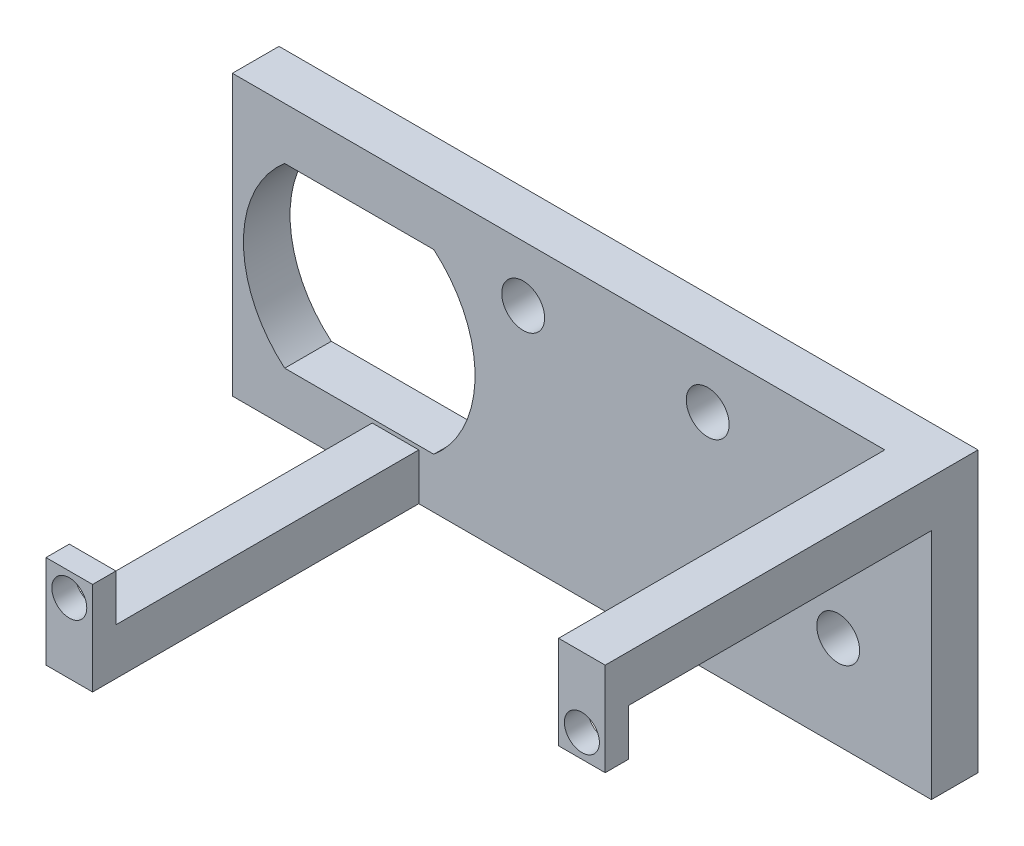
ISO-10303-21;
HEADER;
FILE_DESCRIPTION(('STEP AP214'),'2;1');
FILE_NAME('part.step','',(''),(''),'','','');
FILE_SCHEMA(('AUTOMOTIVE_DESIGN { 1 0 10303 214 1 1 1 1 }'));
ENDSEC;
DATA;
#1=APPLICATION_CONTEXT('core data for automotive mechanical design processes');
#2=APPLICATION_PROTOCOL_DEFINITION('international standard','automotive_design',2000,#1);
#3=PRODUCT_CONTEXT('',#1,'mechanical');
#4=PRODUCT('Part','Part','',(#3));
#5=PRODUCT_RELATED_PRODUCT_CATEGORY('part','',(#4));
#6=PRODUCT_DEFINITION_FORMATION('','',#4);
#7=PRODUCT_DEFINITION_CONTEXT('part definition',#1,'design');
#8=PRODUCT_DEFINITION('design','',#6,#7);
#9=PRODUCT_DEFINITION_SHAPE('','',#8);
#10=(LENGTH_UNIT() NAMED_UNIT(*) SI_UNIT(.MILLI.,.METRE.));
#11=(NAMED_UNIT(*) PLANE_ANGLE_UNIT() SI_UNIT($,.RADIAN.));
#12=(NAMED_UNIT(*) SI_UNIT($,.STERADIAN.) SOLID_ANGLE_UNIT());
#13=UNCERTAINTY_MEASURE_WITH_UNIT(LENGTH_MEASURE(1.E-05),#10,'distance_accuracy_value','');
#14=(GEOMETRIC_REPRESENTATION_CONTEXT(3) GLOBAL_UNCERTAINTY_ASSIGNED_CONTEXT((#13)) GLOBAL_UNIT_ASSIGNED_CONTEXT((#10,
#11,#12)) REPRESENTATION_CONTEXT('',''));
#15=CARTESIAN_POINT('',(0.,0.,0.));
#16=DIRECTION('',(0.,0.,1.));
#17=DIRECTION('',(1.,0.,0.));
#18=AXIS2_PLACEMENT_3D('',#15,#16,#17);
#19=CARTESIAN_POINT('',(-30.,-15.,5.));
#20=DIRECTION('',(1.,0.,0.));
#21=DIRECTION('',(0.,0.,-1.));
#22=AXIS2_PLACEMENT_3D('',#19,#20,#21);
#23=PLANE('',#22);
#24=DIRECTION('',(0.,1.,0.));
#25=VECTOR('',#24,1.);
#26=CARTESIAN_POINT('',(-30.,15.,5.));
#27=LINE('',#26,#25);
#28=CARTESIAN_POINT('',(-30.,-15.,5.));
#29=VERTEX_POINT('',#28);
#30=CARTESIAN_POINT('',(-30.,-10.,5.));
#31=VERTEX_POINT('',#30);
#32=EDGE_CURVE('E191',#29,#31,#27,.T.);
#33=ORIENTED_EDGE('',*,*,#32,.F.);
#34=DIRECTION('',(0.,0.,-1.));
#35=VECTOR('',#34,1.);
#36=CARTESIAN_POINT('',(-30.,-15.,5.));
#37=LINE('',#36,#35);
#38=CARTESIAN_POINT('',(-30.,-15.,40.));
#39=VERTEX_POINT('',#38);
#40=EDGE_CURVE('E47',#39,#29,#37,.T.);
#41=ORIENTED_EDGE('',*,*,#40,.F.);
#42=DIRECTION('',(0.,-1.,0.));
#43=VECTOR('',#42,1.);
#44=CARTESIAN_POINT('',(-30.,-15.,40.));
#45=LINE('',#44,#43);
#46=CARTESIAN_POINT('',(-30.,-5.,40.));
#47=VERTEX_POINT('',#46);
#48=EDGE_CURVE('E275',#47,#39,#45,.T.);
#49=ORIENTED_EDGE('',*,*,#48,.F.);
#50=DIRECTION('',(0.,0.,1.));
#51=VECTOR('',#50,1.);
#52=CARTESIAN_POINT('',(-30.,-5.,37.5));
#53=LINE('',#52,#51);
#54=CARTESIAN_POINT('',(-30.,-5.,37.5));
#55=VERTEX_POINT('',#54);
#56=EDGE_CURVE('E257',#55,#47,#53,.T.);
#57=ORIENTED_EDGE('',*,*,#56,.F.);
#58=DIRECTION('',(0.,-1.,0.));
#59=VECTOR('',#58,1.);
#60=CARTESIAN_POINT('',(-30.,-10.,37.5));
#61=LINE('',#60,#59);
#62=CARTESIAN_POINT('',(-30.,-10.,37.5));
#63=VERTEX_POINT('',#62);
#64=EDGE_CURVE('E242',#55,#63,#61,.T.);
#65=ORIENTED_EDGE('',*,*,#64,.T.);
#66=DIRECTION('',(0.,0.,-1.));
#67=VECTOR('',#66,1.);
#68=CARTESIAN_POINT('',(-30.,-10.,40.));
#69=LINE('',#68,#67);
#70=EDGE_CURVE('E267',#63,#31,#69,.T.);
#71=ORIENTED_EDGE('',*,*,#70,.T.);
#72=EDGE_LOOP('',(#33,#41,#49,#57,#65,#71));
#73=FACE_BOUND('',#72,.T.);
#74=ADVANCED_FACE('F39',(#73),#23,.F.);
#75=CARTESIAN_POINT('',(30.,10.,40.));
#76=DIRECTION('',(0.,1.,0.));
#77=DIRECTION('',(0.,0.,1.));
#78=AXIS2_PLACEMENT_3D('',#75,#76,#77);
#79=PLANE('',#78);
#80=DIRECTION('',(-1.,0.,0.));
#81=VECTOR('',#80,1.);
#82=CARTESIAN_POINT('',(25.,10.,37.5));
#83=LINE('',#82,#81);
#84=CARTESIAN_POINT('',(30.,10.,37.5));
#85=VERTEX_POINT('',#84);
#86=CARTESIAN_POINT('',(25.,10.,37.5));
#87=VERTEX_POINT('',#86);
#88=EDGE_CURVE('E213',#85,#87,#83,.T.);
#89=ORIENTED_EDGE('',*,*,#88,.T.);
#90=DIRECTION('',(0.,0.,-1.));
#91=VECTOR('',#90,1.);
#92=CARTESIAN_POINT('',(25.,10.,40.));
#93=LINE('',#92,#91);
#94=CARTESIAN_POINT('',(25.,10.,5.));
#95=VERTEX_POINT('',#94);
#96=EDGE_CURVE('E298',#87,#95,#93,.T.);
#97=ORIENTED_EDGE('',*,*,#96,.T.);
#98=DIRECTION('',(1.,0.,0.));
#99=VECTOR('',#98,1.);
#100=CARTESIAN_POINT('',(30.,10.,5.));
#101=LINE('',#100,#99);
#102=CARTESIAN_POINT('',(30.,10.,5.));
#103=VERTEX_POINT('',#102);
#104=EDGE_CURVE('E288',#95,#103,#101,.T.);
#105=ORIENTED_EDGE('',*,*,#104,.T.);
#106=DIRECTION('',(0.,0.,-1.));
#107=VECTOR('',#106,1.);
#108=CARTESIAN_POINT('',(30.,10.,40.));
#109=LINE('',#108,#107);
#110=EDGE_CURVE('E292',#85,#103,#109,.T.);
#111=ORIENTED_EDGE('',*,*,#110,.F.);
#112=EDGE_LOOP('',(#89,#97,#105,#111));
#113=FACE_BOUND('',#112,.T.);
#114=ADVANCED_FACE('F370',(#113),#79,.F.);
#115=CARTESIAN_POINT('',(0.,0.,5.));
#116=DIRECTION('',(0.,0.,-1.));
#117=DIRECTION('',(-1.,0.,0.));
#118=AXIS2_PLACEMENT_3D('',#115,#116,#117);
#119=PLANE('',#118);
#120=DIRECTION('',(-1.,0.,0.));
#121=VECTOR('',#120,1.);
#122=CARTESIAN_POINT('',(-23.3941712058157,9.42,5.));
#123=LINE('',#122,#121);
#124=CARTESIAN_POINT('',(-23.3941712058157,9.42,5.));
#125=VERTEX_POINT('',#124);
#126=CARTESIAN_POINT('',(-39.3867351028274,9.42,5.));
#127=VERTEX_POINT('',#126);
#128=EDGE_CURVE('E174',#125,#127,#123,.T.);
#129=ORIENTED_EDGE('',*,*,#128,.F.);
#130=CARTESIAN_POINT('',(-31.3904531543216,-0.0899999999999981,5.));
#131=DIRECTION('',(0.,0.,-1.));
#132=DIRECTION('',(-1.,0.,0.));
#133=AXIS2_PLACEMENT_3D('',#130,#131,#132);
#134=CIRCLE('',#133,12.425);
#135=CARTESIAN_POINT('',(-23.3941712058157,-9.6,5.));
#136=VERTEX_POINT('',#135);
#137=EDGE_CURVE('E181',#136,#125,#134,.F.);
#138=ORIENTED_EDGE('',*,*,#137,.F.);
#139=DIRECTION('',(1.,0.,0.));
#140=VECTOR('',#139,1.);
#141=CARTESIAN_POINT('',(-23.3941712058157,-9.6,5.));
#142=LINE('',#141,#140);
#143=CARTESIAN_POINT('',(-39.3867351028274,-9.6,5.));
#144=VERTEX_POINT('',#143);
#145=EDGE_CURVE('E186',#144,#136,#142,.T.);
#146=ORIENTED_EDGE('',*,*,#145,.F.);
#147=CARTESIAN_POINT('',(-31.3904531543216,-0.0899999999999981,5.));
#148=DIRECTION('',(0.,0.,-1.));
#149=DIRECTION('',(-1.,0.,0.));
#150=AXIS2_PLACEMENT_3D('',#147,#148,#149);
#151=CIRCLE('',#150,12.425);
#152=EDGE_CURVE('E54',#127,#144,#151,.F.);
#153=ORIENTED_EDGE('',*,*,#152,.F.);
#154=EDGE_LOOP('',(#129,#138,#146,#153));
#155=FACE_BOUND('',#154,.T.);
#156=CARTESIAN_POINT('',(-13.8007142674936,9.00071426749366,5.));
#157=DIRECTION('',(0.,0.,1.));
#158=DIRECTION('',(1.,0.,0.));
#159=AXIS2_PLACEMENT_3D('',#156,#157,#158);
#160=CIRCLE('',#159,2.3);
#161=CARTESIAN_POINT('',(-11.5007142674936,9.00071426749366,5.));
#162=VERTEX_POINT('',#161);
#163=EDGE_CURVE('E316',#162,#162,#160,.T.);
#164=ORIENTED_EDGE('',*,*,#163,.F.);
#165=EDGE_LOOP('',(#164));
#166=FACE_BOUND('',#165,.T.);
#167=CARTESIAN_POINT('',(5.99928573250638,9.00071426749366,5.));
#168=DIRECTION('',(0.,0.,1.));
#169=DIRECTION('',(1.,0.,0.));
#170=AXIS2_PLACEMENT_3D('',#167,#168,#169);
#171=CIRCLE('',#170,2.3);
#172=CARTESIAN_POINT('',(8.29928573250638,9.00071426749366,5.));
#173=VERTEX_POINT('',#172);
#174=EDGE_CURVE('E310',#173,#173,#171,.T.);
#175=ORIENTED_EDGE('',*,*,#174,.F.);
#176=EDGE_LOOP('',(#175));
#177=FACE_BOUND('',#176,.T.);
#178=CARTESIAN_POINT('',(20.,-5.,5.));
#179=DIRECTION('',(0.,0.,1.));
#180=DIRECTION('',(1.,0.,0.));
#181=AXIS2_PLACEMENT_3D('',#178,#179,#180);
#182=CIRCLE('',#181,2.3);
#183=CARTESIAN_POINT('',(22.3,-5.,5.));
#184=VERTEX_POINT('',#183);
#185=EDGE_CURVE('E304',#184,#184,#182,.T.);
#186=ORIENTED_EDGE('',*,*,#185,.F.);
#187=EDGE_LOOP('',(#186));
#188=FACE_BOUND('',#187,.T.);
#189=DIRECTION('',(0.,1.,0.));
#190=VECTOR('',#189,1.);
#191=CARTESIAN_POINT('',(-25.,-15.,5.));
#192=LINE('',#191,#190);
#193=CARTESIAN_POINT('',(-25.,-15.,5.));
#194=VERTEX_POINT('',#193);
#195=CARTESIAN_POINT('',(-25.,-10.,5.));
#196=VERTEX_POINT('',#195);
#197=EDGE_CURVE('E274',#194,#196,#192,.T.);
#198=ORIENTED_EDGE('',*,*,#197,.F.);
#199=DIRECTION('',(1.,0.,0.));
#200=VECTOR('',#199,1.);
#201=CARTESIAN_POINT('',(-30.,-15.,5.));
#202=LINE('',#201,#200);
#203=CARTESIAN_POINT('',(30.,-15.,5.));
#204=VERTEX_POINT('',#203);
#205=EDGE_CURVE('E328',#194,#204,#202,.T.);
#206=ORIENTED_EDGE('',*,*,#205,.T.);
#207=DIRECTION('',(0.,1.,0.));
#208=VECTOR('',#207,1.);
#209=CARTESIAN_POINT('',(30.,-15.,5.));
#210=LINE('',#209,#208);
#211=EDGE_CURVE('E322',#204,#103,#210,.T.);
#212=ORIENTED_EDGE('',*,*,#211,.T.);
#213=ORIENTED_EDGE('',*,*,#104,.F.);
#214=DIRECTION('',(0.,-1.,0.));
#215=VECTOR('',#214,1.);
#216=CARTESIAN_POINT('',(25.,15.,5.));
#217=LINE('',#216,#215);
#218=CARTESIAN_POINT('',(25.,15.,5.));
#219=VERTEX_POINT('',#218);
#220=EDGE_CURVE('E278',#219,#95,#217,.T.);
#221=ORIENTED_EDGE('',*,*,#220,.F.);
#222=DIRECTION('',(-1.,0.,0.));
#223=VECTOR('',#222,1.);
#224=CARTESIAN_POINT('',(-30.,15.,5.));
#225=LINE('',#224,#223);
#226=CARTESIAN_POINT('',(-45.,15.,5.));
#227=VERTEX_POINT('',#226);
#228=EDGE_CURVE('E325',#219,#227,#225,.T.);
#229=ORIENTED_EDGE('',*,*,#228,.T.);
#230=DIRECTION('',(0.,1.,0.));
#231=VECTOR('',#230,1.);
#232=CARTESIAN_POINT('',(-45.,15.,5.));
#233=LINE('',#232,#231);
#234=CARTESIAN_POINT('',(-45.,-15.,5.));
#235=VERTEX_POINT('',#234);
#236=EDGE_CURVE('E200',#235,#227,#233,.T.);
#237=ORIENTED_EDGE('',*,*,#236,.F.);
#238=DIRECTION('',(1.,0.,0.));
#239=VECTOR('',#238,1.);
#240=CARTESIAN_POINT('',(-45.,-15.,5.));
#241=LINE('',#240,#239);
#242=EDGE_CURVE('E206',#235,#29,#241,.T.);
#243=ORIENTED_EDGE('',*,*,#242,.T.);
#244=ORIENTED_EDGE('',*,*,#32,.T.);
#245=DIRECTION('',(-1.,0.,0.));
#246=VECTOR('',#245,1.);
#247=CARTESIAN_POINT('',(-30.,-10.,5.));
#248=LINE('',#247,#246);
#249=EDGE_CURVE('E271',#196,#31,#248,.T.);
#250=ORIENTED_EDGE('',*,*,#249,.F.);
#251=EDGE_LOOP('',(#198,#206,#212,#213,#221,#229,#237,#243,#244,#250));
#252=FACE_BOUND('',#251,.T.);
#253=ADVANCED_FACE('F188',(#155,#166,#177,#188,#252),#119,.F.);
#254=CARTESIAN_POINT('',(0.,0.,0.));
#255=DIRECTION('',(0.,0.,-1.));
#256=DIRECTION('',(-1.,0.,0.));
#257=AXIS2_PLACEMENT_3D('',#254,#255,#256);
#258=PLANE('',#257);
#259=CARTESIAN_POINT('',(-31.3904531543216,-0.0899999999999981,0.));
#260=DIRECTION('',(0.,0.,-1.));
#261=DIRECTION('',(-1.,0.,0.));
#262=AXIS2_PLACEMENT_3D('',#259,#260,#261);
#263=CIRCLE('',#262,12.425);
#264=CARTESIAN_POINT('',(-23.3941712058157,9.42,0.));
#265=VERTEX_POINT('',#264);
#266=CARTESIAN_POINT('',(-23.3941712058157,-9.6,0.));
#267=VERTEX_POINT('',#266);
#268=EDGE_CURVE('E62',#265,#267,#263,.T.);
#269=ORIENTED_EDGE('',*,*,#268,.F.);
#270=DIRECTION('',(1.,0.,0.));
#271=VECTOR('',#270,1.);
#272=CARTESIAN_POINT('',(-23.3941712058157,9.42,0.));
#273=LINE('',#272,#271);
#274=CARTESIAN_POINT('',(-39.3867351028274,9.42,0.));
#275=VERTEX_POINT('',#274);
#276=EDGE_CURVE('E176',#275,#265,#273,.T.);
#277=ORIENTED_EDGE('',*,*,#276,.F.);
#278=CARTESIAN_POINT('',(-31.3904531543216,-0.0899999999999981,0.));
#279=DIRECTION('',(0.,0.,-1.));
#280=DIRECTION('',(-1.,0.,0.));
#281=AXIS2_PLACEMENT_3D('',#278,#279,#280);
#282=CIRCLE('',#281,12.425);
#283=CARTESIAN_POINT('',(-39.3867351028274,-9.6,0.));
#284=VERTEX_POINT('',#283);
#285=EDGE_CURVE('E581',#284,#275,#282,.T.);
#286=ORIENTED_EDGE('',*,*,#285,.F.);
#287=DIRECTION('',(-1.,0.,0.));
#288=VECTOR('',#287,1.);
#289=CARTESIAN_POINT('',(-23.3941712058157,-9.6,0.));
#290=LINE('',#289,#288);
#291=EDGE_CURVE('E589',#267,#284,#290,.T.);
#292=ORIENTED_EDGE('',*,*,#291,.F.);
#293=EDGE_LOOP('',(#269,#277,#286,#292));
#294=FACE_BOUND('',#293,.T.);
#295=CARTESIAN_POINT('',(5.99928573250638,9.00071426749366,0.));
#296=DIRECTION('',(0.,0.,1.));
#297=DIRECTION('',(1.,0.,0.));
#298=AXIS2_PLACEMENT_3D('',#295,#296,#297);
#299=CIRCLE('',#298,2.3);
#300=CARTESIAN_POINT('',(8.29928573250638,9.00071426749366,0.));
#301=VERTEX_POINT('',#300);
#302=EDGE_CURVE('E307',#301,#301,#299,.T.);
#303=ORIENTED_EDGE('',*,*,#302,.T.);
#304=EDGE_LOOP('',(#303));
#305=FACE_BOUND('',#304,.T.);
#306=DIRECTION('',(0.,1.,0.));
#307=VECTOR('',#306,1.);
#308=CARTESIAN_POINT('',(30.,-15.,0.));
#309=LINE('',#308,#307);
#310=CARTESIAN_POINT('',(30.,-15.,0.));
#311=VERTEX_POINT('',#310);
#312=CARTESIAN_POINT('',(30.,15.,0.));
#313=VERTEX_POINT('',#312);
#314=EDGE_CURVE('E319',#311,#313,#309,.T.);
#315=ORIENTED_EDGE('',*,*,#314,.F.);
#316=DIRECTION('',(1.,0.,0.));
#317=VECTOR('',#316,1.);
#318=CARTESIAN_POINT('',(-30.,-15.,0.));
#319=LINE('',#318,#317);
#320=CARTESIAN_POINT('',(-45.,-15.,0.));
#321=VERTEX_POINT('',#320);
#322=EDGE_CURVE('E326',#321,#311,#319,.T.);
#323=ORIENTED_EDGE('',*,*,#322,.F.);
#324=DIRECTION('',(0.,-1.,0.));
#325=VECTOR('',#324,1.);
#326=CARTESIAN_POINT('',(-45.,-15.,0.));
#327=LINE('',#326,#325);
#328=CARTESIAN_POINT('',(-45.,15.,0.));
#329=VERTEX_POINT('',#328);
#330=EDGE_CURVE('E195',#329,#321,#327,.T.);
#331=ORIENTED_EDGE('',*,*,#330,.F.);
#332=DIRECTION('',(-1.,0.,0.));
#333=VECTOR('',#332,1.);
#334=CARTESIAN_POINT('',(-30.,15.,0.));
#335=LINE('',#334,#333);
#336=EDGE_CURVE('E333',#313,#329,#335,.T.);
#337=ORIENTED_EDGE('',*,*,#336,.F.);
#338=EDGE_LOOP('',(#315,#323,#331,#337));
#339=FACE_BOUND('',#338,.T.);
#340=CARTESIAN_POINT('',(-13.8007142674936,9.00071426749366,0.));
#341=DIRECTION('',(0.,0.,1.));
#342=DIRECTION('',(1.,0.,0.));
#343=AXIS2_PLACEMENT_3D('',#340,#341,#342);
#344=CIRCLE('',#343,2.3);
#345=CARTESIAN_POINT('',(-11.5007142674936,9.00071426749366,0.));
#346=VERTEX_POINT('',#345);
#347=EDGE_CURVE('E313',#346,#346,#344,.T.);
#348=ORIENTED_EDGE('',*,*,#347,.T.);
#349=EDGE_LOOP('',(#348));
#350=FACE_BOUND('',#349,.T.);
#351=CARTESIAN_POINT('',(20.,-5.,0.));
#352=DIRECTION('',(0.,0.,1.));
#353=DIRECTION('',(1.,0.,0.));
#354=AXIS2_PLACEMENT_3D('',#351,#352,#353);
#355=CIRCLE('',#354,2.3);
#356=CARTESIAN_POINT('',(22.3,-5.,0.));
#357=VERTEX_POINT('',#356);
#358=EDGE_CURVE('E303',#357,#357,#355,.T.);
#359=ORIENTED_EDGE('',*,*,#358,.T.);
#360=EDGE_LOOP('',(#359));
#361=FACE_BOUND('',#360,.T.);
#362=ADVANCED_FACE('F362',(#294,#305,#339,#350,#361),#258,.T.);
#363=CARTESIAN_POINT('',(30.,-15.,5.));
#364=DIRECTION('',(-1.,0.,0.));
#365=DIRECTION('',(0.,0.,1.));
#366=AXIS2_PLACEMENT_3D('',#363,#364,#365);
#367=PLANE('',#366);
#368=ORIENTED_EDGE('',*,*,#314,.T.);
#369=DIRECTION('',(0.,0.,-1.));
#370=VECTOR('',#369,1.);
#371=CARTESIAN_POINT('',(30.,15.,5.));
#372=LINE('',#371,#370);
#373=CARTESIAN_POINT('',(30.,15.,40.));
#374=VERTEX_POINT('',#373);
#375=EDGE_CURVE('E11',#374,#313,#372,.T.);
#376=ORIENTED_EDGE('',*,*,#375,.F.);
#377=DIRECTION('',(0.,1.,0.));
#378=VECTOR('',#377,1.);
#379=CARTESIAN_POINT('',(30.,15.,40.));
#380=LINE('',#379,#378);
#381=CARTESIAN_POINT('',(30.,5.,40.));
#382=VERTEX_POINT('',#381);
#383=EDGE_CURVE('E284',#382,#374,#380,.T.);
#384=ORIENTED_EDGE('',*,*,#383,.F.);
#385=DIRECTION('',(0.,0.,1.));
#386=VECTOR('',#385,1.);
#387=CARTESIAN_POINT('',(30.,5.,37.5));
#388=LINE('',#387,#386);
#389=CARTESIAN_POINT('',(30.,5.,37.5));
#390=VERTEX_POINT('',#389);
#391=EDGE_CURVE('E209',#390,#382,#388,.T.);
#392=ORIENTED_EDGE('',*,*,#391,.F.);
#393=DIRECTION('',(0.,1.,0.));
#394=VECTOR('',#393,1.);
#395=CARTESIAN_POINT('',(30.,10.,37.5));
#396=LINE('',#395,#394);
#397=EDGE_CURVE('E223',#390,#85,#396,.T.);
#398=ORIENTED_EDGE('',*,*,#397,.T.);
#399=ORIENTED_EDGE('',*,*,#110,.T.);
#400=ORIENTED_EDGE('',*,*,#211,.F.);
#401=DIRECTION('',(0.,0.,-1.));
#402=VECTOR('',#401,1.);
#403=CARTESIAN_POINT('',(30.,-15.,5.));
#404=LINE('',#403,#402);
#405=EDGE_CURVE('E330',#204,#311,#404,.T.);
#406=ORIENTED_EDGE('',*,*,#405,.T.);
#407=EDGE_LOOP('',(#368,#376,#384,#392,#398,#399,#400,#406));
#408=FACE_BOUND('',#407,.T.);
#409=ADVANCED_FACE('F41',(#408),#367,.F.);
#410=CARTESIAN_POINT('',(-30.,15.,5.));
#411=DIRECTION('',(0.,-1.,0.));
#412=DIRECTION('',(0.,0.,-1.));
#413=AXIS2_PLACEMENT_3D('',#410,#411,#412);
#414=PLANE('',#413);
#415=ORIENTED_EDGE('',*,*,#336,.T.);
#416=DIRECTION('',(0.,0.,-1.));
#417=VECTOR('',#416,1.);
#418=CARTESIAN_POINT('',(-45.,15.,0.));
#419=LINE('',#418,#417);
#420=EDGE_CURVE('E203',#227,#329,#419,.T.);
#421=ORIENTED_EDGE('',*,*,#420,.F.);
#422=ORIENTED_EDGE('',*,*,#228,.F.);
#423=DIRECTION('',(0.,0.,-1.));
#424=VECTOR('',#423,1.);
#425=CARTESIAN_POINT('',(25.,15.,40.));
#426=LINE('',#425,#424);
#427=CARTESIAN_POINT('',(25.,15.,40.));
#428=VERTEX_POINT('',#427);
#429=EDGE_CURVE('E300',#428,#219,#426,.T.);
#430=ORIENTED_EDGE('',*,*,#429,.F.);
#431=DIRECTION('',(-1.,0.,0.));
#432=VECTOR('',#431,1.);
#433=CARTESIAN_POINT('',(30.,15.,40.));
#434=LINE('',#433,#432);
#435=EDGE_CURVE('E287',#374,#428,#434,.T.);
#436=ORIENTED_EDGE('',*,*,#435,.F.);
#437=ORIENTED_EDGE('',*,*,#375,.T.);
#438=EDGE_LOOP('',(#415,#421,#422,#430,#436,#437));
#439=FACE_BOUND('',#438,.T.);
#440=ADVANCED_FACE('F357',(#439),#414,.F.);
#441=CARTESIAN_POINT('',(-30.,-15.,5.));
#442=DIRECTION('',(0.,1.,0.));
#443=DIRECTION('',(0.,0.,1.));
#444=AXIS2_PLACEMENT_3D('',#441,#442,#443);
#445=PLANE('',#444);
#446=ORIENTED_EDGE('',*,*,#322,.T.);
#447=ORIENTED_EDGE('',*,*,#405,.F.);
#448=ORIENTED_EDGE('',*,*,#205,.F.);
#449=DIRECTION('',(0.,0.,-1.));
#450=VECTOR('',#449,1.);
#451=CARTESIAN_POINT('',(-25.,-15.,40.));
#452=LINE('',#451,#450);
#453=CARTESIAN_POINT('',(-25.,-15.,40.));
#454=VERTEX_POINT('',#453);
#455=EDGE_CURVE('E260',#454,#194,#452,.T.);
#456=ORIENTED_EDGE('',*,*,#455,.F.);
#457=DIRECTION('',(1.,0.,0.));
#458=VECTOR('',#457,1.);
#459=CARTESIAN_POINT('',(-30.,-15.,40.));
#460=LINE('',#459,#458);
#461=EDGE_CURVE('E280',#39,#454,#460,.T.);
#462=ORIENTED_EDGE('',*,*,#461,.F.);
#463=ORIENTED_EDGE('',*,*,#40,.T.);
#464=ORIENTED_EDGE('',*,*,#242,.F.);
#465=DIRECTION('',(0.,0.,1.));
#466=VECTOR('',#465,1.);
#467=CARTESIAN_POINT('',(-45.,-15.,5.));
#468=LINE('',#467,#466);
#469=EDGE_CURVE('E198',#321,#235,#468,.T.);
#470=ORIENTED_EDGE('',*,*,#469,.F.);
#471=EDGE_LOOP('',(#446,#447,#448,#456,#462,#463,#464,#470));
#472=FACE_BOUND('',#471,.T.);
#473=ADVANCED_FACE('F341',(#472),#445,.F.);
#474=CARTESIAN_POINT('',(-13.8007142674936,9.00071426749366,5.));
#475=DIRECTION('',(0.,0.,-1.));
#476=DIRECTION('',(-1.,0.,0.));
#477=AXIS2_PLACEMENT_3D('',#474,#475,#476);
#478=CYLINDRICAL_SURFACE('',#477,2.3);
#479=ORIENTED_EDGE('',*,*,#163,.T.);
#480=EDGE_LOOP('',(#479));
#481=FACE_BOUND('',#480,.T.);
#482=ORIENTED_EDGE('',*,*,#347,.F.);
#483=EDGE_LOOP('',(#482));
#484=FACE_BOUND('',#483,.T.);
#485=ADVANCED_FACE('F410',(#481,#484),#478,.F.);
#486=CARTESIAN_POINT('',(5.99928573250638,9.00071426749366,5.));
#487=DIRECTION('',(0.,0.,-1.));
#488=DIRECTION('',(-1.,0.,0.));
#489=AXIS2_PLACEMENT_3D('',#486,#487,#488);
#490=CYLINDRICAL_SURFACE('',#489,2.3);
#491=ORIENTED_EDGE('',*,*,#174,.T.);
#492=EDGE_LOOP('',(#491));
#493=FACE_BOUND('',#492,.T.);
#494=ORIENTED_EDGE('',*,*,#302,.F.);
#495=EDGE_LOOP('',(#494));
#496=FACE_BOUND('',#495,.T.);
#497=ADVANCED_FACE('F426',(#493,#496),#490,.F.);
#498=CARTESIAN_POINT('',(20.,-5.,5.));
#499=DIRECTION('',(0.,0.,-1.));
#500=DIRECTION('',(-1.,0.,0.));
#501=AXIS2_PLACEMENT_3D('',#498,#499,#500);
#502=CYLINDRICAL_SURFACE('',#501,2.3);
#503=ORIENTED_EDGE('',*,*,#185,.T.);
#504=EDGE_LOOP('',(#503));
#505=FACE_BOUND('',#504,.T.);
#506=ORIENTED_EDGE('',*,*,#358,.F.);
#507=EDGE_LOOP('',(#506));
#508=FACE_BOUND('',#507,.T.);
#509=ADVANCED_FACE('F430',(#505,#508),#502,.F.);
#510=CARTESIAN_POINT('',(25.,15.,40.));
#511=DIRECTION('',(1.,0.,0.));
#512=DIRECTION('',(0.,0.,-1.));
#513=AXIS2_PLACEMENT_3D('',#510,#511,#512);
#514=PLANE('',#513);
#515=ORIENTED_EDGE('',*,*,#220,.T.);
#516=ORIENTED_EDGE('',*,*,#96,.F.);
#517=DIRECTION('',(0.,-1.,0.));
#518=VECTOR('',#517,1.);
#519=CARTESIAN_POINT('',(25.,10.,37.5));
#520=LINE('',#519,#518);
#521=CARTESIAN_POINT('',(25.,5.,37.5));
#522=VERTEX_POINT('',#521);
#523=EDGE_CURVE('E220',#87,#522,#520,.T.);
#524=ORIENTED_EDGE('',*,*,#523,.T.);
#525=DIRECTION('',(0.,0.,1.));
#526=VECTOR('',#525,1.);
#527=CARTESIAN_POINT('',(25.,5.,37.5));
#528=LINE('',#527,#526);
#529=CARTESIAN_POINT('',(25.,5.,40.));
#530=VERTEX_POINT('',#529);
#531=EDGE_CURVE('E210',#522,#530,#528,.T.);
#532=ORIENTED_EDGE('',*,*,#531,.T.);
#533=DIRECTION('',(0.,-1.,0.));
#534=VECTOR('',#533,1.);
#535=CARTESIAN_POINT('',(25.,15.,40.));
#536=LINE('',#535,#534);
#537=EDGE_CURVE('E290',#428,#530,#536,.T.);
#538=ORIENTED_EDGE('',*,*,#537,.F.);
#539=ORIENTED_EDGE('',*,*,#429,.T.);
#540=EDGE_LOOP('',(#515,#516,#524,#532,#538,#539));
#541=FACE_BOUND('',#540,.T.);
#542=ADVANCED_FACE('F374',(#541),#514,.F.);
#543=CARTESIAN_POINT('',(0.,0.,40.));
#544=DIRECTION('',(0.,0.,-1.));
#545=DIRECTION('',(-1.,0.,0.));
#546=AXIS2_PLACEMENT_3D('',#543,#544,#545);
#547=PLANE('',#546);
#548=ORIENTED_EDGE('',*,*,#383,.T.);
#549=ORIENTED_EDGE('',*,*,#435,.T.);
#550=ORIENTED_EDGE('',*,*,#537,.T.);
#551=DIRECTION('',(1.,0.,0.));
#552=VECTOR('',#551,1.);
#553=CARTESIAN_POINT('',(25.,5.,40.));
#554=LINE('',#553,#552);
#555=EDGE_CURVE('E216',#530,#382,#554,.T.);
#556=ORIENTED_EDGE('',*,*,#555,.T.);
#557=EDGE_LOOP('',(#548,#549,#550,#556));
#558=FACE_BOUND('',#557,.T.);
#559=CARTESIAN_POINT('',(27.5,7.5,40.));
#560=DIRECTION('',(0.,0.,1.));
#561=DIRECTION('',(1.,0.,0.));
#562=AXIS2_PLACEMENT_3D('',#559,#560,#561);
#563=CIRCLE('',#562,1.875);
#564=CARTESIAN_POINT('',(29.375,7.5,40.));
#565=VERTEX_POINT('',#564);
#566=EDGE_CURVE('E230',#565,#565,#563,.T.);
#567=ORIENTED_EDGE('',*,*,#566,.F.);
#568=EDGE_LOOP('',(#567));
#569=FACE_BOUND('',#568,.T.);
#570=ADVANCED_FACE('F377',(#558,#569),#547,.F.);
#571=CARTESIAN_POINT('',(-25.,-15.,40.));
#572=DIRECTION('',(-1.,0.,0.));
#573=DIRECTION('',(0.,0.,1.));
#574=AXIS2_PLACEMENT_3D('',#571,#572,#573);
#575=PLANE('',#574);
#576=ORIENTED_EDGE('',*,*,#197,.T.);
#577=DIRECTION('',(0.,0.,-1.));
#578=VECTOR('',#577,1.);
#579=CARTESIAN_POINT('',(-25.,-10.,40.));
#580=LINE('',#579,#578);
#581=CARTESIAN_POINT('',(-25.,-10.,37.5));
#582=VERTEX_POINT('',#581);
#583=EDGE_CURVE('E265',#582,#196,#580,.T.);
#584=ORIENTED_EDGE('',*,*,#583,.F.);
#585=DIRECTION('',(0.,1.,0.));
#586=VECTOR('',#585,1.);
#587=CARTESIAN_POINT('',(-25.,-10.,37.5));
#588=LINE('',#587,#586);
#589=CARTESIAN_POINT('',(-25.,-5.,37.5));
#590=VERTEX_POINT('',#589);
#591=EDGE_CURVE('E248',#582,#590,#588,.T.);
#592=ORIENTED_EDGE('',*,*,#591,.T.);
#593=DIRECTION('',(0.,0.,1.));
#594=VECTOR('',#593,1.);
#595=CARTESIAN_POINT('',(-25.,-5.,37.5));
#596=LINE('',#595,#594);
#597=CARTESIAN_POINT('',(-25.,-5.,40.));
#598=VERTEX_POINT('',#597);
#599=EDGE_CURVE('E254',#590,#598,#596,.T.);
#600=ORIENTED_EDGE('',*,*,#599,.T.);
#601=DIRECTION('',(0.,1.,0.));
#602=VECTOR('',#601,1.);
#603=CARTESIAN_POINT('',(-25.,-15.,40.));
#604=LINE('',#603,#602);
#605=EDGE_CURVE('E270',#454,#598,#604,.T.);
#606=ORIENTED_EDGE('',*,*,#605,.F.);
#607=ORIENTED_EDGE('',*,*,#455,.T.);
#608=EDGE_LOOP('',(#576,#584,#592,#600,#606,#607));
#609=FACE_BOUND('',#608,.T.);
#610=ADVANCED_FACE('F438',(#609),#575,.F.);
#611=CARTESIAN_POINT('',(-30.,-10.,40.));
#612=DIRECTION('',(0.,-1.,0.));
#613=DIRECTION('',(1.,0.,0.));
#614=AXIS2_PLACEMENT_3D('',#611,#612,#613);
#615=PLANE('',#614);
#616=ORIENTED_EDGE('',*,*,#70,.F.);
#617=DIRECTION('',(1.,0.,0.));
#618=VECTOR('',#617,1.);
#619=CARTESIAN_POINT('',(-30.,-10.,37.5));
#620=LINE('',#619,#618);
#621=EDGE_CURVE('E245',#63,#582,#620,.T.);
#622=ORIENTED_EDGE('',*,*,#621,.T.);
#623=ORIENTED_EDGE('',*,*,#583,.T.);
#624=ORIENTED_EDGE('',*,*,#249,.T.);
#625=EDGE_LOOP('',(#616,#622,#623,#624));
#626=FACE_BOUND('',#625,.T.);
#627=ADVANCED_FACE('F443',(#626),#615,.F.);
#628=CARTESIAN_POINT('',(0.,0.,40.));
#629=DIRECTION('',(0.,0.,-1.));
#630=DIRECTION('',(-1.,0.,0.));
#631=AXIS2_PLACEMENT_3D('',#628,#629,#630);
#632=PLANE('',#631);
#633=ORIENTED_EDGE('',*,*,#48,.T.);
#634=ORIENTED_EDGE('',*,*,#461,.T.);
#635=ORIENTED_EDGE('',*,*,#605,.T.);
#636=DIRECTION('',(-1.,0.,0.));
#637=VECTOR('',#636,1.);
#638=CARTESIAN_POINT('',(-30.,-5.,40.));
#639=LINE('',#638,#637);
#640=EDGE_CURVE('E239',#598,#47,#639,.T.);
#641=ORIENTED_EDGE('',*,*,#640,.T.);
#642=EDGE_LOOP('',(#633,#634,#635,#641));
#643=FACE_BOUND('',#642,.T.);
#644=CARTESIAN_POINT('',(-27.5,-7.5,40.));
#645=DIRECTION('',(0.,0.,1.));
#646=DIRECTION('',(1.,0.,0.));
#647=AXIS2_PLACEMENT_3D('',#644,#645,#646);
#648=CIRCLE('',#647,1.875);
#649=CARTESIAN_POINT('',(-25.625,-7.5,40.));
#650=VERTEX_POINT('',#649);
#651=EDGE_CURVE('E233',#650,#650,#648,.T.);
#652=ORIENTED_EDGE('',*,*,#651,.F.);
#653=EDGE_LOOP('',(#652));
#654=FACE_BOUND('',#653,.T.);
#655=ADVANCED_FACE('F439',(#643,#654),#632,.F.);
#656=CARTESIAN_POINT('',(-30.,-5.,37.5));
#657=DIRECTION('',(0.,1.,0.));
#658=DIRECTION('',(0.,0.,1.));
#659=AXIS2_PLACEMENT_3D('',#656,#657,#658);
#660=PLANE('',#659);
#661=ORIENTED_EDGE('',*,*,#640,.F.);
#662=ORIENTED_EDGE('',*,*,#599,.F.);
#663=DIRECTION('',(-1.,0.,0.));
#664=VECTOR('',#663,1.);
#665=CARTESIAN_POINT('',(-30.,-5.,37.5));
#666=LINE('',#665,#664);
#667=EDGE_CURVE('E251',#590,#55,#666,.T.);
#668=ORIENTED_EDGE('',*,*,#667,.T.);
#669=ORIENTED_EDGE('',*,*,#56,.T.);
#670=EDGE_LOOP('',(#661,#662,#668,#669));
#671=FACE_BOUND('',#670,.T.);
#672=ADVANCED_FACE('F442',(#671),#660,.T.);
#673=CARTESIAN_POINT('',(0.,0.,37.5));
#674=DIRECTION('',(0.,0.,-1.));
#675=DIRECTION('',(-1.,0.,0.));
#676=AXIS2_PLACEMENT_3D('',#673,#674,#675);
#677=PLANE('',#676);
#678=CARTESIAN_POINT('',(-27.5,-7.5,37.5));
#679=DIRECTION('',(0.,0.,1.));
#680=DIRECTION('',(1.,0.,0.));
#681=AXIS2_PLACEMENT_3D('',#678,#679,#680);
#682=CIRCLE('',#681,1.875);
#683=CARTESIAN_POINT('',(-25.625,-7.5,37.5));
#684=VERTEX_POINT('',#683);
#685=EDGE_CURVE('E236',#684,#684,#682,.T.);
#686=ORIENTED_EDGE('',*,*,#685,.T.);
#687=EDGE_LOOP('',(#686));
#688=FACE_BOUND('',#687,.T.);
#689=ORIENTED_EDGE('',*,*,#64,.F.);
#690=ORIENTED_EDGE('',*,*,#667,.F.);
#691=ORIENTED_EDGE('',*,*,#591,.F.);
#692=ORIENTED_EDGE('',*,*,#621,.F.);
#693=EDGE_LOOP('',(#689,#690,#691,#692));
#694=FACE_BOUND('',#693,.T.);
#695=ADVANCED_FACE('F453',(#688,#694),#677,.T.);
#696=CARTESIAN_POINT('',(-27.5,-7.5,37.5));
#697=DIRECTION('',(0.,0.,1.));
#698=DIRECTION('',(1.,0.,0.));
#699=AXIS2_PLACEMENT_3D('',#696,#697,#698);
#700=CYLINDRICAL_SURFACE('',#699,1.875);
#701=ORIENTED_EDGE('',*,*,#685,.F.);
#702=EDGE_LOOP('',(#701));
#703=FACE_BOUND('',#702,.T.);
#704=ORIENTED_EDGE('',*,*,#651,.T.);
#705=EDGE_LOOP('',(#704));
#706=FACE_BOUND('',#705,.T.);
#707=ADVANCED_FACE('F396',(#703,#706),#700,.F.);
#708=CARTESIAN_POINT('',(25.,5.,37.5));
#709=DIRECTION('',(0.,-1.,0.));
#710=DIRECTION('',(0.,0.,-1.));
#711=AXIS2_PLACEMENT_3D('',#708,#709,#710);
#712=PLANE('',#711);
#713=ORIENTED_EDGE('',*,*,#555,.F.);
#714=ORIENTED_EDGE('',*,*,#531,.F.);
#715=DIRECTION('',(1.,0.,0.));
#716=VECTOR('',#715,1.);
#717=CARTESIAN_POINT('',(25.,5.,37.5));
#718=LINE('',#717,#716);
#719=EDGE_CURVE('E225',#522,#390,#718,.T.);
#720=ORIENTED_EDGE('',*,*,#719,.T.);
#721=ORIENTED_EDGE('',*,*,#391,.T.);
#722=EDGE_LOOP('',(#713,#714,#720,#721));
#723=FACE_BOUND('',#722,.T.);
#724=ADVANCED_FACE('F382',(#723),#712,.T.);
#725=CARTESIAN_POINT('',(0.,0.,37.5));
#726=DIRECTION('',(0.,0.,1.));
#727=DIRECTION('',(1.,0.,0.));
#728=AXIS2_PLACEMENT_3D('',#725,#726,#727);
#729=PLANE('',#728);
#730=CARTESIAN_POINT('',(27.5,7.5,37.5));
#731=DIRECTION('',(0.,0.,1.));
#732=DIRECTION('',(1.,0.,0.));
#733=AXIS2_PLACEMENT_3D('',#730,#731,#732);
#734=CIRCLE('',#733,1.875);
#735=CARTESIAN_POINT('',(29.375,7.5,37.5));
#736=VERTEX_POINT('',#735);
#737=EDGE_CURVE('E219',#736,#736,#734,.T.);
#738=ORIENTED_EDGE('',*,*,#737,.T.);
#739=EDGE_LOOP('',(#738));
#740=FACE_BOUND('',#739,.T.);
#741=ORIENTED_EDGE('',*,*,#523,.F.);
#742=ORIENTED_EDGE('',*,*,#88,.F.);
#743=ORIENTED_EDGE('',*,*,#397,.F.);
#744=ORIENTED_EDGE('',*,*,#719,.F.);
#745=EDGE_LOOP('',(#741,#742,#743,#744));
#746=FACE_BOUND('',#745,.T.);
#747=ADVANCED_FACE('F385',(#740,#746),#729,.F.);
#748=CARTESIAN_POINT('',(27.5,7.5,37.5));
#749=DIRECTION('',(0.,0.,1.));
#750=DIRECTION('',(1.,0.,0.));
#751=AXIS2_PLACEMENT_3D('',#748,#749,#750);
#752=CYLINDRICAL_SURFACE('',#751,1.875);
#753=ORIENTED_EDGE('',*,*,#737,.F.);
#754=EDGE_LOOP('',(#753));
#755=FACE_BOUND('',#754,.T.);
#756=ORIENTED_EDGE('',*,*,#566,.T.);
#757=EDGE_LOOP('',(#756));
#758=FACE_BOUND('',#757,.T.);
#759=ADVANCED_FACE('F387',(#755,#758),#752,.F.);
#760=CARTESIAN_POINT('',(-45.,0.,0.));
#761=DIRECTION('',(1.,0.,0.));
#762=DIRECTION('',(0.,0.,-1.));
#763=AXIS2_PLACEMENT_3D('',#760,#761,#762);
#764=PLANE('',#763);
#765=ORIENTED_EDGE('',*,*,#330,.T.);
#766=ORIENTED_EDGE('',*,*,#469,.T.);
#767=ORIENTED_EDGE('',*,*,#236,.T.);
#768=ORIENTED_EDGE('',*,*,#420,.T.);
#769=EDGE_LOOP('',(#765,#766,#767,#768));
#770=FACE_BOUND('',#769,.T.);
#771=ADVANCED_FACE('F354',(#770),#764,.F.);
#772=CARTESIAN_POINT('',(-31.3904531543216,-0.0899999999999981,40.001));
#773=DIRECTION('',(0.,0.,-1.));
#774=DIRECTION('',(-1.,0.,0.));
#775=AXIS2_PLACEMENT_3D('',#772,#773,#774);
#776=CYLINDRICAL_SURFACE('',#775,12.425);
#777=ORIENTED_EDGE('',*,*,#137,.T.);
#778=DIRECTION('',(0.,0.,-1.));
#779=VECTOR('',#778,1.);
#780=CARTESIAN_POINT('',(-23.3941712058157,9.42,40.001));
#781=LINE('',#780,#779);
#782=EDGE_CURVE('E170',#125,#265,#781,.T.);
#783=ORIENTED_EDGE('',*,*,#782,.T.);
#784=ORIENTED_EDGE('',*,*,#268,.T.);
#785=DIRECTION('',(0.,0.,-1.));
#786=VECTOR('',#785,1.);
#787=CARTESIAN_POINT('',(-23.3941712058157,-9.6,40.001));
#788=LINE('',#787,#786);
#789=EDGE_CURVE('E178',#136,#267,#788,.T.);
#790=ORIENTED_EDGE('',*,*,#789,.F.);
#791=EDGE_LOOP('',(#777,#783,#784,#790));
#792=FACE_BOUND('',#791,.T.);
#793=ADVANCED_FACE('F182',(#792),#776,.F.);
#794=CARTESIAN_POINT('',(-23.3941712058157,9.42,40.001));
#795=DIRECTION('',(0.,1.,0.));
#796=DIRECTION('',(0.,0.,1.));
#797=AXIS2_PLACEMENT_3D('',#794,#795,#796);
#798=PLANE('',#797);
#799=ORIENTED_EDGE('',*,*,#128,.T.);
#800=DIRECTION('',(0.,0.,-1.));
#801=VECTOR('',#800,1.);
#802=CARTESIAN_POINT('',(-39.3867351028274,9.42,40.001));
#803=LINE('',#802,#801);
#804=EDGE_CURVE('E177',#127,#275,#803,.T.);
#805=ORIENTED_EDGE('',*,*,#804,.T.);
#806=ORIENTED_EDGE('',*,*,#276,.T.);
#807=ORIENTED_EDGE('',*,*,#782,.F.);
#808=EDGE_LOOP('',(#799,#805,#806,#807));
#809=FACE_BOUND('',#808,.T.);
#810=ADVANCED_FACE('F172',(#809),#798,.F.);
#811=CARTESIAN_POINT('',(-31.3904531543216,-0.0899999999999981,40.001));
#812=DIRECTION('',(0.,0.,-1.));
#813=DIRECTION('',(-1.,0.,0.));
#814=AXIS2_PLACEMENT_3D('',#811,#812,#813);
#815=CYLINDRICAL_SURFACE('',#814,12.425);
#816=ORIENTED_EDGE('',*,*,#152,.T.);
#817=DIRECTION('',(0.,0.,-1.));
#818=VECTOR('',#817,1.);
#819=CARTESIAN_POINT('',(-39.3867351028274,-9.6,40.001));
#820=LINE('',#819,#818);
#821=EDGE_CURVE('E579',#144,#284,#820,.T.);
#822=ORIENTED_EDGE('',*,*,#821,.T.);
#823=ORIENTED_EDGE('',*,*,#285,.T.);
#824=ORIENTED_EDGE('',*,*,#804,.F.);
#825=EDGE_LOOP('',(#816,#822,#823,#824));
#826=FACE_BOUND('',#825,.T.);
#827=ADVANCED_FACE('F556',(#826),#815,.F.);
#828=CARTESIAN_POINT('',(-23.3941712058157,-9.6,40.001));
#829=DIRECTION('',(0.,-1.,0.));
#830=DIRECTION('',(0.,0.,-1.));
#831=AXIS2_PLACEMENT_3D('',#828,#829,#830);
#832=PLANE('',#831);
#833=ORIENTED_EDGE('',*,*,#145,.T.);
#834=ORIENTED_EDGE('',*,*,#789,.T.);
#835=ORIENTED_EDGE('',*,*,#291,.T.);
#836=ORIENTED_EDGE('',*,*,#821,.F.);
#837=EDGE_LOOP('',(#833,#834,#835,#836));
#838=FACE_BOUND('',#837,.T.);
#839=ADVANCED_FACE('F565',(#838),#832,.F.);
#840=CLOSED_SHELL('',(#74,#114,#253,#362,#409,#440,#473,#485,#497,#509,#542,#570,#610,#627,#655,
#672,#695,#707,#724,#747,#759,#771,#793,#810,#827,#839));
#841=MANIFOLD_SOLID_BREP('B2',#840);
#842=ADVANCED_BREP_SHAPE_REPRESENTATION('',(#18,#841),#14);
#843=SHAPE_DEFINITION_REPRESENTATION(#9,#842);
ENDSEC;
END-ISO-10303-21;
